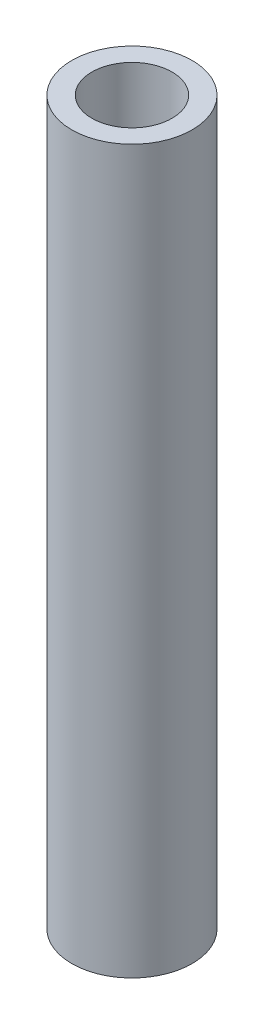
ISO-10303-21;
HEADER;
FILE_DESCRIPTION(('STEP AP214'),'2;1');
FILE_NAME('part.step','',(''),(''),'','','');
FILE_SCHEMA(('AUTOMOTIVE_DESIGN { 1 0 10303 214 1 1 1 1 }'));
ENDSEC;
DATA;
#1=APPLICATION_CONTEXT('core data for automotive mechanical design processes');
#2=APPLICATION_PROTOCOL_DEFINITION('international standard','automotive_design',2000,#1);
#3=PRODUCT_CONTEXT('',#1,'mechanical');
#4=PRODUCT('Part','Part','',(#3));
#5=PRODUCT_RELATED_PRODUCT_CATEGORY('part','',(#4));
#6=PRODUCT_DEFINITION_FORMATION('','',#4);
#7=PRODUCT_DEFINITION_CONTEXT('part definition',#1,'design');
#8=PRODUCT_DEFINITION('design','',#6,#7);
#9=PRODUCT_DEFINITION_SHAPE('','',#8);
#10=(LENGTH_UNIT() NAMED_UNIT(*) SI_UNIT(.MILLI.,.METRE.));
#11=(NAMED_UNIT(*) PLANE_ANGLE_UNIT() SI_UNIT($,.RADIAN.));
#12=(NAMED_UNIT(*) SI_UNIT($,.STERADIAN.) SOLID_ANGLE_UNIT());
#13=UNCERTAINTY_MEASURE_WITH_UNIT(LENGTH_MEASURE(1.E-05),#10,'distance_accuracy_value','');
#14=(GEOMETRIC_REPRESENTATION_CONTEXT(3) GLOBAL_UNCERTAINTY_ASSIGNED_CONTEXT((#13)) GLOBAL_UNIT_ASSIGNED_CONTEXT((#10,
#11,#12)) REPRESENTATION_CONTEXT('',''));
#15=CARTESIAN_POINT('',(0.,0.,0.));
#16=DIRECTION('',(0.,0.,1.));
#17=DIRECTION('',(1.,0.,0.));
#18=AXIS2_PLACEMENT_3D('',#15,#16,#17);
#19=CARTESIAN_POINT('',(0.,54.,0.));
#20=DIRECTION('',(0.,1.,0.));
#21=DIRECTION('',(0.,0.,1.));
#22=AXIS2_PLACEMENT_3D('',#19,#20,#21);
#23=PLANE('',#22);
#24=CARTESIAN_POINT('',(0.,54.,0.));
#25=DIRECTION('',(0.,1.,0.));
#26=DIRECTION('',(0.,0.,1.));
#27=AXIS2_PLACEMENT_3D('',#24,#25,#26);
#28=CIRCLE('',#27,4.5);
#29=CARTESIAN_POINT('',(0.,54.,4.5));
#30=VERTEX_POINT('',#29);
#31=EDGE_CURVE('E10',#30,#30,#28,.T.);
#32=ORIENTED_EDGE('',*,*,#31,.T.);
#33=EDGE_LOOP('',(#32));
#34=FACE_BOUND('',#33,.T.);
#35=CARTESIAN_POINT('',(0.,54.,0.));
#36=DIRECTION('',(0.,1.,0.));
#37=DIRECTION('',(0.,0.,1.));
#38=AXIS2_PLACEMENT_3D('',#35,#36,#37);
#39=CIRCLE('',#38,3.);
#40=CARTESIAN_POINT('',(0.,54.,3.));
#41=VERTEX_POINT('',#40);
#42=EDGE_CURVE('E39',#41,#41,#39,.T.);
#43=ORIENTED_EDGE('',*,*,#42,.F.);
#44=EDGE_LOOP('',(#43));
#45=FACE_BOUND('',#44,.T.);
#46=ADVANCED_FACE('F28',(#34,#45),#23,.T.);
#47=CARTESIAN_POINT('',(0.,0.,0.));
#48=DIRECTION('',(0.,1.,0.));
#49=DIRECTION('',(0.,0.,1.));
#50=AXIS2_PLACEMENT_3D('',#47,#48,#49);
#51=PLANE('',#50);
#52=CARTESIAN_POINT('',(0.,0.,0.));
#53=DIRECTION('',(0.,1.,0.));
#54=DIRECTION('',(0.,0.,1.));
#55=AXIS2_PLACEMENT_3D('',#52,#53,#54);
#56=CIRCLE('',#55,4.5);
#57=CARTESIAN_POINT('',(0.,0.,4.5));
#58=VERTEX_POINT('',#57);
#59=EDGE_CURVE('E32',#58,#58,#56,.T.);
#60=ORIENTED_EDGE('',*,*,#59,.F.);
#61=EDGE_LOOP('',(#60));
#62=FACE_BOUND('',#61,.T.);
#63=CARTESIAN_POINT('',(0.,0.,0.));
#64=DIRECTION('',(0.,1.,0.));
#65=DIRECTION('',(0.,0.,1.));
#66=AXIS2_PLACEMENT_3D('',#63,#64,#65);
#67=CIRCLE('',#66,3.);
#68=CARTESIAN_POINT('',(0.,0.,3.));
#69=VERTEX_POINT('',#68);
#70=EDGE_CURVE('E41',#69,#69,#67,.T.);
#71=ORIENTED_EDGE('',*,*,#70,.T.);
#72=EDGE_LOOP('',(#71));
#73=FACE_BOUND('',#72,.T.);
#74=ADVANCED_FACE('F51',(#62,#73),#51,.F.);
#75=CARTESIAN_POINT('',(0.,54.,0.));
#76=DIRECTION('',(0.,-1.,0.));
#77=DIRECTION('',(0.,0.,-1.));
#78=AXIS2_PLACEMENT_3D('',#75,#76,#77);
#79=CYLINDRICAL_SURFACE('',#78,4.5);
#80=ORIENTED_EDGE('',*,*,#31,.F.);
#81=EDGE_LOOP('',(#80));
#82=FACE_BOUND('',#81,.T.);
#83=ORIENTED_EDGE('',*,*,#59,.T.);
#84=EDGE_LOOP('',(#83));
#85=FACE_BOUND('',#84,.T.);
#86=ADVANCED_FACE('F30',(#82,#85),#79,.T.);
#87=CARTESIAN_POINT('',(0.,54.,0.));
#88=DIRECTION('',(0.,-1.,0.));
#89=DIRECTION('',(0.,0.,-1.));
#90=AXIS2_PLACEMENT_3D('',#87,#88,#89);
#91=CYLINDRICAL_SURFACE('',#90,3.);
#92=ORIENTED_EDGE('',*,*,#42,.T.);
#93=EDGE_LOOP('',(#92));
#94=FACE_BOUND('',#93,.T.);
#95=ORIENTED_EDGE('',*,*,#70,.F.);
#96=EDGE_LOOP('',(#95));
#97=FACE_BOUND('',#96,.T.);
#98=ADVANCED_FACE('F47',(#94,#97),#91,.F.);
#99=CLOSED_SHELL('',(#46,#74,#86,#98));
#100=MANIFOLD_SOLID_BREP('B2',#99);
#101=ADVANCED_BREP_SHAPE_REPRESENTATION('',(#18,#100),#14);
#102=SHAPE_DEFINITION_REPRESENTATION(#9,#101);
ENDSEC;
END-ISO-10303-21;
